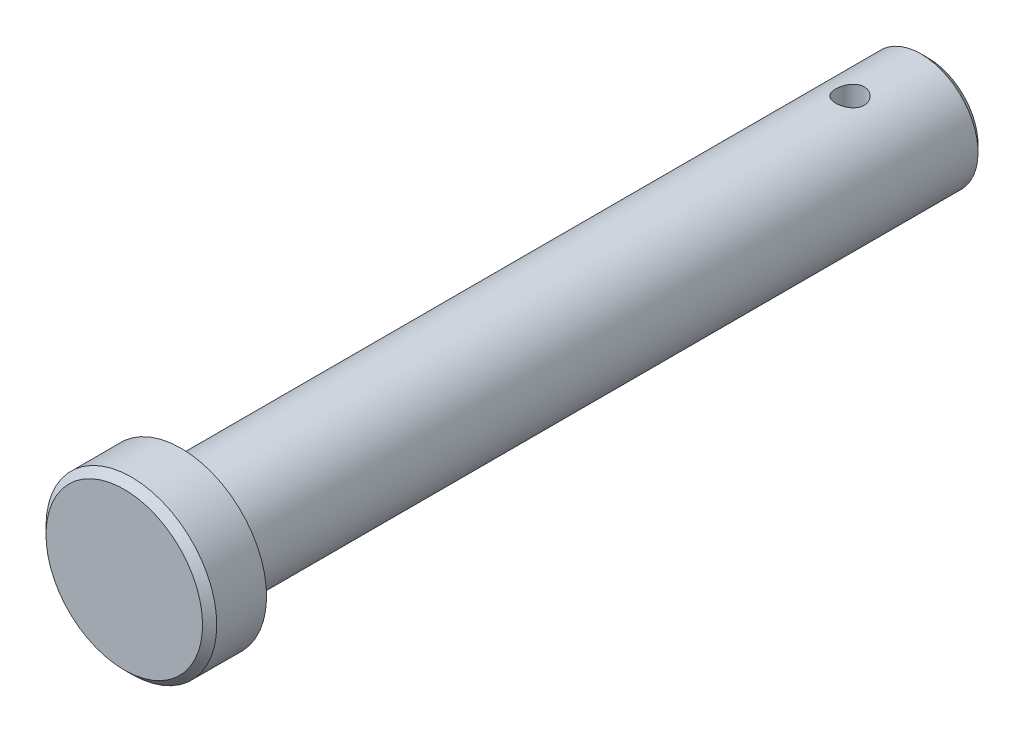
ISO-10303-21;
HEADER;
FILE_DESCRIPTION(('STEP AP214'),'2;1');
FILE_NAME('part.step','',(''),(''),'','','');
FILE_SCHEMA(('AUTOMOTIVE_DESIGN { 1 0 10303 214 1 1 1 1 }'));
ENDSEC;
DATA;
#1=APPLICATION_CONTEXT('core data for automotive mechanical design processes');
#2=APPLICATION_PROTOCOL_DEFINITION('international standard','automotive_design',2000,#1);
#3=PRODUCT_CONTEXT('',#1,'mechanical');
#4=PRODUCT('Part','Part','',(#3));
#5=PRODUCT_RELATED_PRODUCT_CATEGORY('part','',(#4));
#6=PRODUCT_DEFINITION_FORMATION('','',#4);
#7=PRODUCT_DEFINITION_CONTEXT('part definition',#1,'design');
#8=PRODUCT_DEFINITION('design','',#6,#7);
#9=PRODUCT_DEFINITION_SHAPE('','',#8);
#10=(LENGTH_UNIT() NAMED_UNIT(*) SI_UNIT(.MILLI.,.METRE.));
#11=(NAMED_UNIT(*) PLANE_ANGLE_UNIT() SI_UNIT($,.RADIAN.));
#12=(NAMED_UNIT(*) SI_UNIT($,.STERADIAN.) SOLID_ANGLE_UNIT());
#13=UNCERTAINTY_MEASURE_WITH_UNIT(LENGTH_MEASURE(1.E-05),#10,'distance_accuracy_value','');
#14=(GEOMETRIC_REPRESENTATION_CONTEXT(3) GLOBAL_UNCERTAINTY_ASSIGNED_CONTEXT((#13)) GLOBAL_UNIT_ASSIGNED_CONTEXT((#10,
#11,#12)) REPRESENTATION_CONTEXT('',''));
#15=CARTESIAN_POINT('',(0.,0.,0.));
#16=DIRECTION('',(0.,0.,1.));
#17=DIRECTION('',(1.,0.,0.));
#18=AXIS2_PLACEMENT_3D('',#15,#16,#17);
#19=CARTESIAN_POINT('',(0.,0.,0.));
#20=DIRECTION('',(0.,0.,1.));
#21=DIRECTION('',(0.,-1.,0.));
#22=AXIS2_PLACEMENT_3D('',#19,#20,#21);
#23=PLANE('',#22);
#24=CARTESIAN_POINT('',(0.,0.,0.));
#25=DIRECTION('',(0.,0.,1.));
#26=DIRECTION('',(0.,-1.,0.));
#27=AXIS2_PLACEMENT_3D('',#24,#25,#26);
#28=CIRCLE('',#27,11.);
#29=CARTESIAN_POINT('',(0.,-11.,0.));
#30=VERTEX_POINT('',#29);
#31=EDGE_CURVE('E10',#30,#30,#28,.T.);
#32=ORIENTED_EDGE('',*,*,#31,.T.);
#33=EDGE_LOOP('',(#32));
#34=FACE_BOUND('',#33,.T.);
#35=ADVANCED_FACE('F45',(#34),#23,.T.);
#36=CARTESIAN_POINT('',(0.,0.,-113.));
#37=DIRECTION('',(0.,0.,-1.));
#38=DIRECTION('',(0.,1.,0.));
#39=AXIS2_PLACEMENT_3D('',#36,#37,#38);
#40=CYLINDRICAL_SURFACE('',#39,12.);
#41=CARTESIAN_POINT('',(0.,0.,-1.));
#42=DIRECTION('',(0.,0.,1.));
#43=DIRECTION('',(0.,-1.,0.));
#44=AXIS2_PLACEMENT_3D('',#41,#42,#43);
#45=CIRCLE('',#44,12.);
#46=CARTESIAN_POINT('',(0.,-12.,-1.));
#47=VERTEX_POINT('',#46);
#48=EDGE_CURVE('E54',#47,#47,#45,.F.);
#49=ORIENTED_EDGE('',*,*,#48,.T.);
#50=EDGE_LOOP('',(#49));
#51=FACE_BOUND('',#50,.T.);
#52=CARTESIAN_POINT('',(0.,0.,-7.99999999999999));
#53=DIRECTION('',(0.,0.,-1.));
#54=DIRECTION('',(0.,1.,0.));
#55=AXIS2_PLACEMENT_3D('',#52,#53,#54);
#56=CIRCLE('',#55,12.);
#57=CARTESIAN_POINT('',(0.,12.,-7.99999999999999));
#58=VERTEX_POINT('',#57);
#59=EDGE_CURVE('E70',#58,#58,#56,.T.);
#60=ORIENTED_EDGE('',*,*,#59,.F.);
#61=EDGE_LOOP('',(#60));
#62=FACE_BOUND('',#61,.T.);
#63=ADVANCED_FACE('F106',(#51,#62),#40,.T.);
#64=CARTESIAN_POINT('',(0.,12.,-8.));
#65=DIRECTION('',(0.,0.,-1.));
#66=DIRECTION('',(0.,1.,0.));
#67=AXIS2_PLACEMENT_3D('',#64,#65,#66);
#68=PLANE('',#67);
#69=ORIENTED_EDGE('',*,*,#59,.T.);
#70=EDGE_LOOP('',(#69));
#71=FACE_BOUND('',#70,.T.);
#72=CARTESIAN_POINT('',(0.,0.,-7.99999999999999));
#73=DIRECTION('',(0.,0.,-1.));
#74=DIRECTION('',(0.,1.,0.));
#75=AXIS2_PLACEMENT_3D('',#72,#73,#74);
#76=CIRCLE('',#75,8.00000000000001);
#77=CARTESIAN_POINT('',(0.,8.00000000000001,-7.99999999999999));
#78=VERTEX_POINT('',#77);
#79=EDGE_CURVE('E80',#78,#78,#76,.T.);
#80=ORIENTED_EDGE('',*,*,#79,.F.);
#81=EDGE_LOOP('',(#80));
#82=FACE_BOUND('',#81,.T.);
#83=ADVANCED_FACE('F103',(#71,#82),#68,.T.);
#84=CARTESIAN_POINT('',(0.,0.,-113.));
#85=DIRECTION('',(0.,0.,-1.));
#86=DIRECTION('',(0.,1.,0.));
#87=AXIS2_PLACEMENT_3D('',#84,#85,#86);
#88=CYLINDRICAL_SURFACE('',#87,8.);
#89=CARTESIAN_POINT('',(0.,0.,-112.));
#90=DIRECTION('',(0.,0.,-1.));
#91=DIRECTION('',(0.,1.,0.));
#92=AXIS2_PLACEMENT_3D('',#89,#90,#91);
#93=CIRCLE('',#92,8.);
#94=CARTESIAN_POINT('',(0.,8.00000000000001,-112.));
#95=VERTEX_POINT('',#94);
#96=EDGE_CURVE('E59',#95,#95,#93,.F.);
#97=ORIENTED_EDGE('',*,*,#96,.T.);
#98=EDGE_LOOP('',(#97));
#99=FACE_BOUND('',#98,.T.);
#100=CARTESIAN_POINT('',(0.,8.00000000000001,-100.));
#101=CARTESIAN_POINT('',(0.110501451559641,7.99999813157351,-100.000003100984));
#102=CARTESIAN_POINT('',(0.22103754377435,7.99768770842436,-100.009188734365));
#103=CARTESIAN_POINT('',(0.438941765027375,7.98869485106527,-100.045633535076));
#104=CARTESIAN_POINT('',(0.546308062494318,7.98200993893302,-100.07290294605));
#105=CARTESIAN_POINT('',(0.754694496243434,7.96500835109377,-100.144585671283));
#106=CARTESIAN_POINT('',(0.855722084573335,7.95469603789412,-100.188978398287));
#107=CARTESIAN_POINT('',(1.04889617587257,7.93153791743496,-100.293575186726));
#108=CARTESIAN_POINT('',(1.14104237913168,7.9186920247221,-100.353779781492));
#109=CARTESIAN_POINT('',(1.31573590306788,7.89156551455592,-100.489601052872));
#110=CARTESIAN_POINT('',(1.39807425341474,7.87726276197503,-100.565482099945));
#111=CARTESIAN_POINT('',(1.54899856960442,7.8489816015725,-100.729936273212));
#112=CARTESIAN_POINT('',(1.61758298259892,7.83500323053158,-100.818510830596));
#113=CARTESIAN_POINT('',(1.74003539039863,7.80873034264226,-101.007460302316));
#114=CARTESIAN_POINT('',(1.79366962123352,7.79646392619749,-101.107990974412));
#115=CARTESIAN_POINT('',(1.88319587806766,7.77532659757356,-101.316997882213));
#116=CARTESIAN_POINT('',(1.91909074058685,7.76645514259226,-101.425472844443));
#117=CARTESIAN_POINT('',(1.97140644907302,7.75333968928431,-101.644991330936));
#118=CARTESIAN_POINT('',(1.98820302444274,7.74900654662682,-101.755939861384));
#119=CARTESIAN_POINT('',(2.00301570008854,7.74519149946123,-101.979158091999));
#120=CARTESIAN_POINT('',(2.00103485575748,7.74570880570572,-102.091427574256));
#121=CARTESIAN_POINT('',(1.97864869951961,7.75145607355757,-102.311221076994));
#122=CARTESIAN_POINT('',(1.95869112025418,7.75657150676392,-102.418794161954));
#123=CARTESIAN_POINT('',(1.90163224920399,7.77075612894759,-102.629014734548));
#124=CARTESIAN_POINT('',(1.86452973609253,7.77982559958986,-102.731661870705));
#125=CARTESIAN_POINT('',(1.77385263724958,7.80100151874213,-102.930317355003));
#126=CARTESIAN_POINT('',(1.72011555631056,7.81313769959756,-103.026248229053));
#127=CARTESIAN_POINT('',(1.59780836801993,7.83906281127989,-103.207891613009));
#128=CARTESIAN_POINT('',(1.52923566507845,7.85285203112838,-103.293602330756));
#129=CARTESIAN_POINT('',(1.37688456624163,7.88101174053189,-103.454938154259));
#130=CARTESIAN_POINT('',(1.29272834422115,7.89538759304002,-103.530205986748));
#131=CARTESIAN_POINT('',(1.11281589000494,7.92274620771676,-103.665628323285));
#132=CARTESIAN_POINT('',(1.0170593036106,7.93572892732544,-103.725782365685));
#133=CARTESIAN_POINT('',(0.816154518241863,7.95890309458921,-103.829400781633));
#134=CARTESIAN_POINT('',(0.710975190944838,7.96908480170304,-103.872807120339));
#135=CARTESIAN_POINT('',(0.494501344190514,7.9854388932189,-103.941223074279));
#136=CARTESIAN_POINT('',(0.383207998867313,7.99161204452375,-103.966236208558));
#137=CARTESIAN_POINT('',(0.160719960520033,7.99913999028501,-103.996610087412));
#138=CARTESIAN_POINT('',(0.0495956266509442,8.00061404677706,-104.0024573681));
#139=CARTESIAN_POINT('',(-0.172043833068678,7.99891739752602,-103.995667997259));
#140=CARTESIAN_POINT('',(-0.28255901285946,7.99574710989129,-103.983033009601));
#141=CARTESIAN_POINT('',(-0.498152358368653,7.98519441503144,-103.940038788811));
#142=CARTESIAN_POINT('',(-0.603286825291669,7.97787512247749,-103.909944982031));
#143=CARTESIAN_POINT('',(-0.807009723270012,7.95984942178846,-103.833190554629));
#144=CARTESIAN_POINT('',(-0.90559749204351,7.94914267159857,-103.786528260916));
#145=CARTESIAN_POINT('',(-1.0953641792398,7.92524410568415,-103.677018494834));
#146=CARTESIAN_POINT('',(-1.18638058911444,7.91201156489244,-103.613898516804));
#147=CARTESIAN_POINT('',(-1.35670215152433,7.88459345583227,-103.473613454937));
#148=CARTESIAN_POINT('',(-1.43600527863068,7.87040772335607,-103.396445947177));
#149=CARTESIAN_POINT('',(-1.58265409076364,7.84225275947696,-103.227997385541));
#150=CARTESIAN_POINT('',(-1.6496584901627,7.82829738916376,-103.136416395997));
#151=CARTESIAN_POINT('',(-1.76734767868359,7.80257171169653,-102.943023154046));
#152=CARTESIAN_POINT('',(-1.81803319221058,7.79080130756036,-102.841211356054));
#153=CARTESIAN_POINT('',(-1.90126856081239,7.77090792979554,-102.630792370116));
#154=CARTESIAN_POINT('',(-1.93392586220542,7.76276340389208,-102.522229828875));
#155=CARTESIAN_POINT('',(-1.98046087993837,7.75102325453579,-102.300920482815));
#156=CARTESIAN_POINT('',(-1.99434270330488,7.74742663626583,-102.188174598623));
#157=CARTESIAN_POINT('',(-2.00271812044533,7.7452653493861,-101.965171968193));
#158=CARTESIAN_POINT('',(-1.99775719704016,7.74655910304352,-101.854936753167));
#159=CARTESIAN_POINT('',(-1.96983637108383,7.75370545343791,-101.636928148443));
#160=CARTESIAN_POINT('',(-1.94687683024903,7.7595579585581,-101.529154709315));
#161=CARTESIAN_POINT('',(-1.88390842592373,7.77508347576964,-101.319722054579));
#162=CARTESIAN_POINT('',(-1.84400187290717,7.78473353648413,-101.21803025968));
#163=CARTESIAN_POINT('',(-1.7483532181401,7.80677007633106,-101.022712823048));
#164=CARTESIAN_POINT('',(-1.69260892004559,7.81915693494365,-100.929088302417));
#165=CARTESIAN_POINT('',(-1.56515699818285,7.84567512351351,-100.749927161331));
#166=CARTESIAN_POINT('',(-1.49307088388301,7.8598435310901,-100.664665235435));
#167=CARTESIAN_POINT('',(-1.33571916158631,7.88810702995049,-100.507270606939));
#168=CARTESIAN_POINT('',(-1.25045042834819,7.90220210302747,-100.435141026516));
#169=CARTESIAN_POINT('',(-1.06729011560345,7.92903540863552,-100.304784921914));
#170=CARTESIAN_POINT('',(-0.969197896421848,7.94174444487825,-100.246833848438));
#171=CARTESIAN_POINT('',(-0.764354746013967,7.96406566633492,-100.148336716079));
#172=CARTESIAN_POINT('',(-0.657610084582319,7.97368006933043,-100.107778185802));
#173=CARTESIAN_POINT('',(-0.459213670991296,7.98730746087389,-100.05123755956));
#174=CARTESIAN_POINT('',(-0.368506894544091,7.99203446736921,-100.032065009262));
#175=CARTESIAN_POINT('',(-0.18520809538171,7.99838140309266,-100.006445408504));
#176=CARTESIAN_POINT('',(-0.0926162149901549,8.00000156601194,-99.9999974009263));
#177=CARTESIAN_POINT('',(0.,8.00000000000001,-100.));
#178=B_SPLINE_CURVE_WITH_KNOTS('',3,(#100,#101,#102,#103,#104,#105,#106,#107,#108,#109,#110,
#111,#112,#113,#114,#115,#116,#117,#118,#119,#120,#121,#122,#123,#124,#125,#126,#127,#128,#129,
#130,#131,#132,#133,#134,#135,#136,#137,#138,#139,#140,#141,#142,#143,#144,#145,#146,#147,#148,
#149,#150,#151,#152,#153,#154,#155,#156,#157,#158,#159,#160,#161,#162,#163,#164,#165,#166,#167,
#168,#169,#170,#171,#172,#173,#174,#175,#176,#177),.UNSPECIFIED.,.T.,.F.,(4,2,2,2,2,2,2,2,2,2,2,
2,2,2,2,2,2,2,2,2,2,2,2,2,2,2,2,2,2,2,2,2,2,2,2,2,2,2,4),(0.,0.331164949962518,
0.662517650351866,0.993473203048138,1.32443992022577,1.66152580582851,1.99864972773414,
2.34078196727742,2.68285948225824,3.01808393468092,3.35325384154689,3.68029996013783,
4.00736937959146,4.33774037169601,4.66816921119311,5.00802001296453,5.34788119415423,
5.68890972016579,6.02987298255952,6.36211078603463,6.69431868154751,7.02160366023143,
7.34892169767481,7.68204783424896,8.01523150681786,8.35659345610394,8.69794025003771,
9.03723006156476,9.3764456434097,9.70591707202576,10.0353818794581,10.3628853408369,
10.6904342418696,11.0265276855097,11.3627009303165,11.7049624733721,12.0469781843289,
12.3245632392729,12.6021274139515),.UNSPECIFIED.);
#179=CARTESIAN_POINT('',(0.,8.00000000000001,-100.));
#180=VERTEX_POINT('',#179);
#181=EDGE_CURVE('E71',#180,#180,#178,.T.);
#182=ORIENTED_EDGE('',*,*,#181,.F.);
#183=EDGE_LOOP('',(#182));
#184=FACE_BOUND('',#183,.T.);
#185=CARTESIAN_POINT('',(0.,-8.,-100.));
#186=CARTESIAN_POINT('',(-0.110501451559641,-7.99999813157349,-100.000003100984));
#187=CARTESIAN_POINT('',(-0.22103754377435,-7.99768770842434,-100.009188734365));
#188=CARTESIAN_POINT('',(-0.438941765027375,-7.98869485106525,-100.045633535076));
#189=CARTESIAN_POINT('',(-0.546308062494317,-7.98200993893301,-100.07290294605));
#190=CARTESIAN_POINT('',(-0.754694496243433,-7.96500835109376,-100.144585671283));
#191=CARTESIAN_POINT('',(-0.855722084573334,-7.95469603789411,-100.188978398287));
#192=CARTESIAN_POINT('',(-1.04889617587257,-7.93153791743495,-100.293575186726));
#193=CARTESIAN_POINT('',(-1.14104237913168,-7.91869202472208,-100.353779781492));
#194=CARTESIAN_POINT('',(-1.31573590306788,-7.89156551455591,-100.489601052872));
#195=CARTESIAN_POINT('',(-1.39807425341474,-7.87726276197501,-100.565482099945));
#196=CARTESIAN_POINT('',(-1.54899856960442,-7.84898160157248,-100.729936273212));
#197=CARTESIAN_POINT('',(-1.61758298259892,-7.83500323053156,-100.818510830596));
#198=CARTESIAN_POINT('',(-1.74003539039863,-7.80873034264224,-101.007460302316));
#199=CARTESIAN_POINT('',(-1.79366962123352,-7.79646392619748,-101.107990974412));
#200=CARTESIAN_POINT('',(-1.88319587806766,-7.77532659757355,-101.316997882213));
#201=CARTESIAN_POINT('',(-1.91909074058685,-7.76645514259224,-101.425472844443));
#202=CARTESIAN_POINT('',(-1.97140644907302,-7.7533396892843,-101.644991330936));
#203=CARTESIAN_POINT('',(-1.98820302444274,-7.74900654662681,-101.755939861384));
#204=CARTESIAN_POINT('',(-2.00301570008854,-7.74519149946122,-101.979158091999));
#205=CARTESIAN_POINT('',(-2.00103485575748,-7.74570880570571,-102.091427574256));
#206=CARTESIAN_POINT('',(-1.97864869951961,-7.75145607355756,-102.311221076994));
#207=CARTESIAN_POINT('',(-1.95869112025418,-7.75657150676391,-102.418794161954));
#208=CARTESIAN_POINT('',(-1.90163224920399,-7.77075612894758,-102.629014734548));
#209=CARTESIAN_POINT('',(-1.86452973609253,-7.77982559958985,-102.731661870705));
#210=CARTESIAN_POINT('',(-1.77385263724958,-7.80100151874212,-102.930317355003));
#211=CARTESIAN_POINT('',(-1.72011555631056,-7.81313769959754,-103.026248229053));
#212=CARTESIAN_POINT('',(-1.59780836801993,-7.83906281127987,-103.207891613009));
#213=CARTESIAN_POINT('',(-1.52923566507845,-7.85285203112837,-103.293602330756));
#214=CARTESIAN_POINT('',(-1.37688456624163,-7.88101174053188,-103.454938154259));
#215=CARTESIAN_POINT('',(-1.29272834422115,-7.89538759304001,-103.530205986748));
#216=CARTESIAN_POINT('',(-1.11281589000494,-7.92274620771674,-103.665628323285));
#217=CARTESIAN_POINT('',(-1.0170593036106,-7.93572892732543,-103.725782365685));
#218=CARTESIAN_POINT('',(-0.816154518241863,-7.9589030945892,-103.829400781633));
#219=CARTESIAN_POINT('',(-0.710975190944838,-7.96908480170302,-103.872807120339));
#220=CARTESIAN_POINT('',(-0.494501344190514,-7.98543889321888,-103.941223074279));
#221=CARTESIAN_POINT('',(-0.383207998867313,-7.99161204452373,-103.966236208558));
#222=CARTESIAN_POINT('',(-0.160719960520033,-7.999139990285,-103.996610087412));
#223=CARTESIAN_POINT('',(-0.0495956266509442,-8.00061404677705,-104.0024573681));
#224=CARTESIAN_POINT('',(0.172043833068678,-7.998917397526,-103.995667997259));
#225=CARTESIAN_POINT('',(0.28255901285946,-7.99574710989128,-103.983033009601));
#226=CARTESIAN_POINT('',(0.498152358368653,-7.98519441503142,-103.940038788811));
#227=CARTESIAN_POINT('',(0.603286825291669,-7.97787512247748,-103.909944982031));
#228=CARTESIAN_POINT('',(0.807009723270011,-7.95984942178845,-103.833190554629));
#229=CARTESIAN_POINT('',(0.90559749204351,-7.94914267159856,-103.786528260916));
#230=CARTESIAN_POINT('',(1.0953641792398,-7.92524410568414,-103.677018494834));
#231=CARTESIAN_POINT('',(1.18638058911444,-7.91201156489243,-103.613898516804));
#232=CARTESIAN_POINT('',(1.35670215152433,-7.88459345583225,-103.473613454937));
#233=CARTESIAN_POINT('',(1.43600527863068,-7.87040772335606,-103.396445947177));
#234=CARTESIAN_POINT('',(1.58265409076364,-7.84225275947694,-103.227997385541));
#235=CARTESIAN_POINT('',(1.6496584901627,-7.82829738916374,-103.136416395997));
#236=CARTESIAN_POINT('',(1.76734767868359,-7.80257171169651,-102.943023154046));
#237=CARTESIAN_POINT('',(1.81803319221058,-7.79080130756034,-102.841211356054));
#238=CARTESIAN_POINT('',(1.90126856081238,-7.77090792979553,-102.630792370116));
#239=CARTESIAN_POINT('',(1.93392586220541,-7.76276340389207,-102.522229828875));
#240=CARTESIAN_POINT('',(1.98046087993837,-7.75102325453578,-102.300920482815));
#241=CARTESIAN_POINT('',(1.99434270330488,-7.74742663626581,-102.188174598623));
#242=CARTESIAN_POINT('',(2.00271812044533,-7.74526534938609,-101.965171968193));
#243=CARTESIAN_POINT('',(1.99775719704016,-7.74655910304351,-101.854936753167));
#244=CARTESIAN_POINT('',(1.96983637108383,-7.7537054534379,-101.636928148443));
#245=CARTESIAN_POINT('',(1.94687683024903,-7.75955795855809,-101.529154709315));
#246=CARTESIAN_POINT('',(1.88390842592373,-7.77508347576963,-101.319722054579));
#247=CARTESIAN_POINT('',(1.84400187290717,-7.78473353648412,-101.21803025968));
#248=CARTESIAN_POINT('',(1.7483532181401,-7.80677007633104,-101.022712823048));
#249=CARTESIAN_POINT('',(1.69260892004559,-7.81915693494363,-100.929088302417));
#250=CARTESIAN_POINT('',(1.56515699818286,-7.84567512351349,-100.749927161331));
#251=CARTESIAN_POINT('',(1.49307088388301,-7.85984353109009,-100.664665235435));
#252=CARTESIAN_POINT('',(1.33571916158632,-7.88810702995047,-100.507270606939));
#253=CARTESIAN_POINT('',(1.2504504283482,-7.90220210302746,-100.435141026516));
#254=CARTESIAN_POINT('',(1.06729011560345,-7.9290354086355,-100.304784921914));
#255=CARTESIAN_POINT('',(0.969197896421848,-7.94174444487824,-100.246833848438));
#256=CARTESIAN_POINT('',(0.764354746013967,-7.96406566633491,-100.148336716079));
#257=CARTESIAN_POINT('',(0.657610084582319,-7.97368006933041,-100.107778185802));
#258=CARTESIAN_POINT('',(0.459213670991295,-7.98730746087388,-100.05123755956));
#259=CARTESIAN_POINT('',(0.36850689454409,-7.9920344673692,-100.032065009262));
#260=CARTESIAN_POINT('',(0.185208095381709,-7.99838140309264,-100.006445408504));
#261=CARTESIAN_POINT('',(0.0926162149901543,-8.00000156601192,-99.9999974009263));
#262=CARTESIAN_POINT('',(0.,-8.,-100.));
#263=B_SPLINE_CURVE_WITH_KNOTS('',3,(#185,#186,#187,#188,#189,#190,#191,#192,#193,#194,#195,
#196,#197,#198,#199,#200,#201,#202,#203,#204,#205,#206,#207,#208,#209,#210,#211,#212,#213,#214,
#215,#216,#217,#218,#219,#220,#221,#222,#223,#224,#225,#226,#227,#228,#229,#230,#231,#232,#233,
#234,#235,#236,#237,#238,#239,#240,#241,#242,#243,#244,#245,#246,#247,#248,#249,#250,#251,#252,
#253,#254,#255,#256,#257,#258,#259,#260,#261,#262),.UNSPECIFIED.,.T.,.F.,(4,2,2,2,2,2,2,2,2,2,2,
2,2,2,2,2,2,2,2,2,2,2,2,2,2,2,2,2,2,2,2,2,2,2,2,2,2,2,4),(0.,0.331164949962517,
0.662517650351866,0.993473203048136,1.32443992022577,1.66152580582851,1.99864972773416,
2.34078196727742,2.68285948225824,3.01808393468092,3.35325384154689,3.68029996013784,
4.00736937959146,4.33774037169599,4.66816921119311,5.00802001296453,5.34788119415423,
5.68890972016579,6.02987298255952,6.36211078603463,6.69431868154751,7.02160366023143,
7.34892169767481,7.68204783424896,8.01523150681786,8.35659345610394,8.69794025003771,
9.03723006156474,9.3764456434097,9.70591707202576,10.0353818794581,10.3628853408369,
10.6904342418696,11.0265276855097,11.3627009303165,11.7049624733721,12.0469781843289,
12.3245632392729,12.6021274139515),.UNSPECIFIED.);
#264=CARTESIAN_POINT('',(0.,-8.,-100.));
#265=VERTEX_POINT('',#264);
#266=EDGE_CURVE('E81',#265,#265,#263,.T.);
#267=ORIENTED_EDGE('',*,*,#266,.F.);
#268=EDGE_LOOP('',(#267));
#269=FACE_BOUND('',#268,.T.);
#270=ORIENTED_EDGE('',*,*,#79,.T.);
#271=EDGE_LOOP('',(#270));
#272=FACE_BOUND('',#271,.T.);
#273=ADVANCED_FACE('F86',(#99,#184,#269,#272),#88,.T.);
#274=CARTESIAN_POINT('',(0.,8.00000000000001,-113.));
#275=DIRECTION('',(0.,0.,-1.));
#276=DIRECTION('',(0.,1.,0.));
#277=AXIS2_PLACEMENT_3D('',#274,#275,#276);
#278=PLANE('',#277);
#279=CARTESIAN_POINT('',(0.,0.,-113.));
#280=DIRECTION('',(0.,0.,-1.));
#281=DIRECTION('',(0.,1.,0.));
#282=AXIS2_PLACEMENT_3D('',#279,#280,#281);
#283=CIRCLE('',#282,7.00000000000003);
#284=CARTESIAN_POINT('',(0.,7.00000000000004,-113.));
#285=VERTEX_POINT('',#284);
#286=EDGE_CURVE('E64',#285,#285,#283,.T.);
#287=ORIENTED_EDGE('',*,*,#286,.T.);
#288=EDGE_LOOP('',(#287));
#289=FACE_BOUND('',#288,.T.);
#290=ADVANCED_FACE('F94',(#289),#278,.T.);
#291=CARTESIAN_POINT('',(0.,-12.,-102.));
#292=DIRECTION('',(0.,1.,0.));
#293=DIRECTION('',(0.,0.,1.));
#294=AXIS2_PLACEMENT_3D('',#291,#292,#293);
#295=CYLINDRICAL_SURFACE('',#294,2.);
#296=ORIENTED_EDGE('',*,*,#181,.T.);
#297=EDGE_LOOP('',(#296));
#298=FACE_BOUND('',#297,.T.);
#299=ORIENTED_EDGE('',*,*,#266,.T.);
#300=EDGE_LOOP('',(#299));
#301=FACE_BOUND('',#300,.T.);
#302=ADVANCED_FACE('F90',(#298,#301),#295,.F.);
#303=CARTESIAN_POINT('',(0.,0.,-113.));
#304=DIRECTION('',(0.,0.,1.));
#305=DIRECTION('',(0.,-1.,0.));
#306=AXIS2_PLACEMENT_3D('',#303,#304,#305);
#307=CONICAL_SURFACE('',#306,7.00000000000003,0.785398163397447);
#308=ORIENTED_EDGE('',*,*,#96,.F.);
#309=EDGE_LOOP('',(#308));
#310=FACE_BOUND('',#309,.T.);
#311=ORIENTED_EDGE('',*,*,#286,.F.);
#312=EDGE_LOOP('',(#311));
#313=FACE_BOUND('',#312,.T.);
#314=ADVANCED_FACE('F93',(#310,#313),#307,.T.);
#315=CARTESIAN_POINT('',(0.,0.,-1.));
#316=DIRECTION('',(0.,0.,-1.));
#317=DIRECTION('',(0.,1.,0.));
#318=AXIS2_PLACEMENT_3D('',#315,#316,#317);
#319=CONICAL_SURFACE('',#318,12.,0.785398163397451);
#320=ORIENTED_EDGE('',*,*,#31,.F.);
#321=EDGE_LOOP('',(#320));
#322=FACE_BOUND('',#321,.T.);
#323=ORIENTED_EDGE('',*,*,#48,.F.);
#324=EDGE_LOOP('',(#323));
#325=FACE_BOUND('',#324,.T.);
#326=ADVANCED_FACE('F48',(#322,#325),#319,.T.);
#327=CLOSED_SHELL('',(#35,#63,#83,#273,#290,#302,#314,#326));
#328=MANIFOLD_SOLID_BREP('B2',#327);
#329=ADVANCED_BREP_SHAPE_REPRESENTATION('',(#18,#328),#14);
#330=SHAPE_DEFINITION_REPRESENTATION(#9,#329);
ENDSEC;
END-ISO-10303-21;
